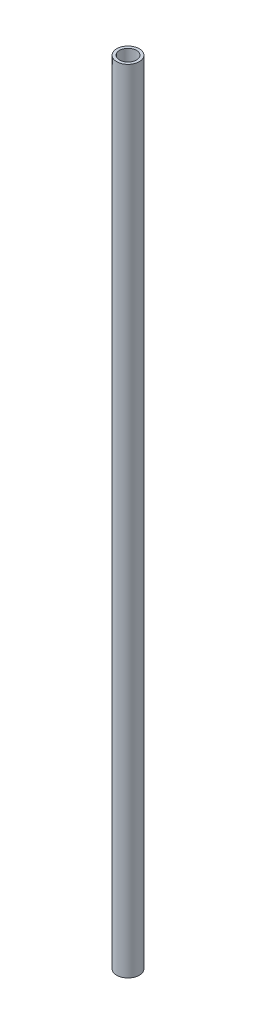
ISO-10303-21;
HEADER;
FILE_DESCRIPTION(('STEP AP214'),'2;1');
FILE_NAME('part.step','',(''),(''),'','','');
FILE_SCHEMA(('AUTOMOTIVE_DESIGN { 1 0 10303 214 1 1 1 1 }'));
ENDSEC;
DATA;
#1=APPLICATION_CONTEXT('core data for automotive mechanical design processes');
#2=APPLICATION_PROTOCOL_DEFINITION('international standard','automotive_design',2000,#1);
#3=PRODUCT_CONTEXT('',#1,'mechanical');
#4=PRODUCT('Part','Part','',(#3));
#5=PRODUCT_RELATED_PRODUCT_CATEGORY('part','',(#4));
#6=PRODUCT_DEFINITION_FORMATION('','',#4);
#7=PRODUCT_DEFINITION_CONTEXT('part definition',#1,'design');
#8=PRODUCT_DEFINITION('design','',#6,#7);
#9=PRODUCT_DEFINITION_SHAPE('','',#8);
#10=(LENGTH_UNIT() NAMED_UNIT(*) SI_UNIT(.MILLI.,.METRE.));
#11=(NAMED_UNIT(*) PLANE_ANGLE_UNIT() SI_UNIT($,.RADIAN.));
#12=(NAMED_UNIT(*) SI_UNIT($,.STERADIAN.) SOLID_ANGLE_UNIT());
#13=UNCERTAINTY_MEASURE_WITH_UNIT(LENGTH_MEASURE(1.E-05),#10,'distance_accuracy_value','');
#14=(GEOMETRIC_REPRESENTATION_CONTEXT(3) GLOBAL_UNCERTAINTY_ASSIGNED_CONTEXT((#13)) GLOBAL_UNIT_ASSIGNED_CONTEXT((#10,
#11,#12)) REPRESENTATION_CONTEXT('',''));
#15=CARTESIAN_POINT('',(0.,0.,0.));
#16=DIRECTION('',(0.,0.,1.));
#17=DIRECTION('',(1.,0.,0.));
#18=AXIS2_PLACEMENT_3D('',#15,#16,#17);
#19=CARTESIAN_POINT('',(0.,446.2018,0.));
#20=DIRECTION('',(0.,1.,0.));
#21=DIRECTION('',(0.,0.,1.));
#22=AXIS2_PLACEMENT_3D('',#19,#20,#21);
#23=PLANE('',#22);
#24=CARTESIAN_POINT('',(0.,446.2018,0.));
#25=DIRECTION('',(0.,1.,0.));
#26=DIRECTION('',(0.,0.,1.));
#27=AXIS2_PLACEMENT_3D('',#24,#25,#26);
#28=CIRCLE('',#27,6.35);
#29=CARTESIAN_POINT('',(0.,446.2018,6.35));
#30=VERTEX_POINT('',#29);
#31=EDGE_CURVE('E10',#30,#30,#28,.T.);
#32=ORIENTED_EDGE('',*,*,#31,.T.);
#33=EDGE_LOOP('',(#32));
#34=FACE_BOUND('',#33,.T.);
#35=CARTESIAN_POINT('',(0.,446.2018,0.));
#36=DIRECTION('',(0.,1.,0.));
#37=DIRECTION('',(0.,0.,1.));
#38=AXIS2_PLACEMENT_3D('',#35,#36,#37);
#39=CIRCLE('',#38,4.7625);
#40=CARTESIAN_POINT('',(0.,446.2018,4.7625));
#41=VERTEX_POINT('',#40);
#42=EDGE_CURVE('E43',#41,#41,#39,.T.);
#43=ORIENTED_EDGE('',*,*,#42,.F.);
#44=EDGE_LOOP('',(#43));
#45=FACE_BOUND('',#44,.T.);
#46=ADVANCED_FACE('F32',(#34,#45),#23,.T.);
#47=CARTESIAN_POINT('',(0.,0.,0.));
#48=DIRECTION('',(0.,1.,0.));
#49=DIRECTION('',(0.,0.,1.));
#50=AXIS2_PLACEMENT_3D('',#47,#48,#49);
#51=PLANE('',#50);
#52=CARTESIAN_POINT('',(0.,0.,0.));
#53=DIRECTION('',(0.,1.,0.));
#54=DIRECTION('',(0.,0.,1.));
#55=AXIS2_PLACEMENT_3D('',#52,#53,#54);
#56=CIRCLE('',#55,6.35);
#57=CARTESIAN_POINT('',(0.,0.,6.35));
#58=VERTEX_POINT('',#57);
#59=EDGE_CURVE('E36',#58,#58,#56,.T.);
#60=ORIENTED_EDGE('',*,*,#59,.F.);
#61=EDGE_LOOP('',(#60));
#62=FACE_BOUND('',#61,.T.);
#63=CARTESIAN_POINT('',(0.,0.,0.));
#64=DIRECTION('',(0.,1.,0.));
#65=DIRECTION('',(0.,0.,1.));
#66=AXIS2_PLACEMENT_3D('',#63,#64,#65);
#67=CIRCLE('',#66,4.7625);
#68=CARTESIAN_POINT('',(0.,0.,4.7625));
#69=VERTEX_POINT('',#68);
#70=EDGE_CURVE('E45',#69,#69,#67,.T.);
#71=ORIENTED_EDGE('',*,*,#70,.T.);
#72=EDGE_LOOP('',(#71));
#73=FACE_BOUND('',#72,.T.);
#74=ADVANCED_FACE('F55',(#62,#73),#51,.F.);
#75=CARTESIAN_POINT('',(0.,446.2018,0.));
#76=DIRECTION('',(0.,-1.,0.));
#77=DIRECTION('',(0.,0.,-1.));
#78=AXIS2_PLACEMENT_3D('',#75,#76,#77);
#79=CYLINDRICAL_SURFACE('',#78,6.35);
#80=ORIENTED_EDGE('',*,*,#31,.F.);
#81=EDGE_LOOP('',(#80));
#82=FACE_BOUND('',#81,.T.);
#83=ORIENTED_EDGE('',*,*,#59,.T.);
#84=EDGE_LOOP('',(#83));
#85=FACE_BOUND('',#84,.T.);
#86=ADVANCED_FACE('F34',(#82,#85),#79,.T.);
#87=CARTESIAN_POINT('',(0.,446.2018,0.));
#88=DIRECTION('',(0.,-1.,0.));
#89=DIRECTION('',(0.,0.,-1.));
#90=AXIS2_PLACEMENT_3D('',#87,#88,#89);
#91=CYLINDRICAL_SURFACE('',#90,4.7625);
#92=ORIENTED_EDGE('',*,*,#42,.T.);
#93=EDGE_LOOP('',(#92));
#94=FACE_BOUND('',#93,.T.);
#95=ORIENTED_EDGE('',*,*,#70,.F.);
#96=EDGE_LOOP('',(#95));
#97=FACE_BOUND('',#96,.T.);
#98=ADVANCED_FACE('F51',(#94,#97),#91,.F.);
#99=CLOSED_SHELL('',(#46,#74,#86,#98));
#100=MANIFOLD_SOLID_BREP('B2',#99);
#101=ADVANCED_BREP_SHAPE_REPRESENTATION('',(#18,#100),#14);
#102=SHAPE_DEFINITION_REPRESENTATION(#9,#101);
ENDSEC;
END-ISO-10303-21;
